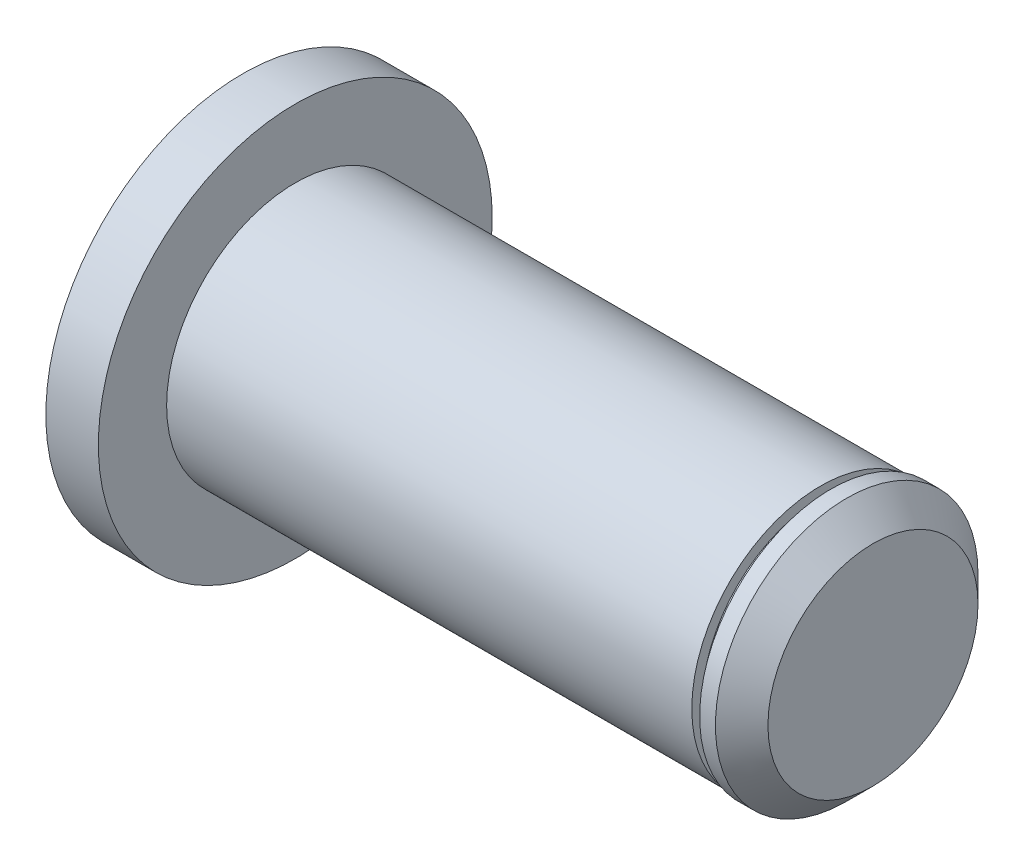
ISO-10303-21;
HEADER;
FILE_DESCRIPTION(('STEP AP214'),'2;1');
FILE_NAME('part.step','',(''),(''),'','','');
FILE_SCHEMA(('AUTOMOTIVE_DESIGN { 1 0 10303 214 1 1 1 1 }'));
ENDSEC;
DATA;
#1=APPLICATION_CONTEXT('core data for automotive mechanical design processes');
#2=APPLICATION_PROTOCOL_DEFINITION('international standard','automotive_design',2000,#1);
#3=PRODUCT_CONTEXT('',#1,'mechanical');
#4=PRODUCT('Part','Part','',(#3));
#5=PRODUCT_RELATED_PRODUCT_CATEGORY('part','',(#4));
#6=PRODUCT_DEFINITION_FORMATION('','',#4);
#7=PRODUCT_DEFINITION_CONTEXT('part definition',#1,'design');
#8=PRODUCT_DEFINITION('design','',#6,#7);
#9=PRODUCT_DEFINITION_SHAPE('','',#8);
#10=(LENGTH_UNIT() NAMED_UNIT(*) SI_UNIT(.MILLI.,.METRE.));
#11=(NAMED_UNIT(*) PLANE_ANGLE_UNIT() SI_UNIT($,.RADIAN.));
#12=(NAMED_UNIT(*) SI_UNIT($,.STERADIAN.) SOLID_ANGLE_UNIT());
#13=UNCERTAINTY_MEASURE_WITH_UNIT(LENGTH_MEASURE(1.E-05),#10,'distance_accuracy_value','');
#14=(GEOMETRIC_REPRESENTATION_CONTEXT(3) GLOBAL_UNCERTAINTY_ASSIGNED_CONTEXT((#13)) GLOBAL_UNIT_ASSIGNED_CONTEXT((#10,
#11,#12)) REPRESENTATION_CONTEXT('',''));
#15=CARTESIAN_POINT('',(0.,0.,0.));
#16=DIRECTION('',(0.,0.,1.));
#17=DIRECTION('',(1.,0.,0.));
#18=AXIS2_PLACEMENT_3D('',#15,#16,#17);
#19=CARTESIAN_POINT('',(110.,0.,0.));
#20=DIRECTION('',(1.,0.,0.));
#21=DIRECTION('',(0.,0.,-1.));
#22=AXIS2_PLACEMENT_3D('',#19,#20,#21);
#23=CYLINDRICAL_SURFACE('',#22,22.5);
#24=CARTESIAN_POINT('',(110.,0.,0.));
#25=DIRECTION('',(1.,0.,0.));
#26=DIRECTION('',(0.,0.,-1.));
#27=AXIS2_PLACEMENT_3D('',#24,#25,#26);
#28=CIRCLE('',#27,22.5);
#29=CARTESIAN_POINT('',(110.,0.,-22.5000000000001));
#30=VERTEX_POINT('',#29);
#31=EDGE_CURVE('E54',#30,#30,#28,.T.);
#32=ORIENTED_EDGE('',*,*,#31,.T.);
#33=EDGE_LOOP('',(#32));
#34=FACE_BOUND('',#33,.T.);
#35=CARTESIAN_POINT('',(112.,0.,0.));
#36=DIRECTION('',(1.,0.,0.));
#37=DIRECTION('',(0.,0.,-1.));
#38=AXIS2_PLACEMENT_3D('',#35,#36,#37);
#39=CIRCLE('',#38,22.5);
#40=CARTESIAN_POINT('',(112.,0.,-22.5000000000001));
#41=VERTEX_POINT('',#40);
#42=EDGE_CURVE('E51',#41,#41,#39,.F.);
#43=ORIENTED_EDGE('',*,*,#42,.T.);
#44=EDGE_LOOP('',(#43));
#45=FACE_BOUND('',#44,.T.);
#46=ADVANCED_FACE('F33',(#34,#45),#23,.T.);
#47=CARTESIAN_POINT('',(120.,0.,0.));
#48=DIRECTION('',(-1.,0.,0.));
#49=DIRECTION('',(0.,0.,1.));
#50=AXIS2_PLACEMENT_3D('',#47,#48,#49);
#51=CYLINDRICAL_SURFACE('',#50,24.5);
#52=CARTESIAN_POINT('',(10.,0.,0.));
#53=DIRECTION('',(1.,0.,0.));
#54=DIRECTION('',(0.,0.,-1.));
#55=AXIS2_PLACEMENT_3D('',#52,#53,#54);
#56=CIRCLE('',#55,24.5);
#57=CARTESIAN_POINT('',(10.,0.,-24.5000000000001));
#58=VERTEX_POINT('',#57);
#59=EDGE_CURVE('E58',#58,#58,#56,.T.);
#60=ORIENTED_EDGE('',*,*,#59,.T.);
#61=EDGE_LOOP('',(#60));
#62=FACE_BOUND('',#61,.T.);
#63=CARTESIAN_POINT('',(110.,0.,0.));
#64=DIRECTION('',(1.,0.,0.));
#65=DIRECTION('',(0.,0.,-1.));
#66=AXIS2_PLACEMENT_3D('',#63,#64,#65);
#67=CIRCLE('',#66,24.5);
#68=CARTESIAN_POINT('',(110.,0.,-24.5000000000001));
#69=VERTEX_POINT('',#68);
#70=EDGE_CURVE('E56',#69,#69,#67,.T.);
#71=ORIENTED_EDGE('',*,*,#70,.F.);
#72=EDGE_LOOP('',(#71));
#73=FACE_BOUND('',#72,.T.);
#74=ADVANCED_FACE('F87',(#62,#73),#51,.T.);
#75=CARTESIAN_POINT('',(10.,0.,0.));
#76=DIRECTION('',(1.,0.,0.));
#77=DIRECTION('',(0.,0.,-1.));
#78=AXIS2_PLACEMENT_3D('',#75,#76,#77);
#79=PLANE('',#78);
#80=CARTESIAN_POINT('',(10.,0.,0.));
#81=DIRECTION('',(1.,0.,0.));
#82=DIRECTION('',(0.,0.,-1.));
#83=AXIS2_PLACEMENT_3D('',#80,#81,#82);
#84=CIRCLE('',#83,37.5);
#85=CARTESIAN_POINT('',(10.,0.,-37.5000000000001));
#86=VERTEX_POINT('',#85);
#87=EDGE_CURVE('E44',#86,#86,#84,.T.);
#88=ORIENTED_EDGE('',*,*,#87,.T.);
#89=EDGE_LOOP('',(#88));
#90=FACE_BOUND('',#89,.T.);
#91=ORIENTED_EDGE('',*,*,#59,.F.);
#92=EDGE_LOOP('',(#91));
#93=FACE_BOUND('',#92,.T.);
#94=ADVANCED_FACE('F93',(#90,#93),#79,.T.);
#95=CARTESIAN_POINT('',(10.,0.,0.));
#96=DIRECTION('',(-1.,0.,0.));
#97=DIRECTION('',(0.,0.,1.));
#98=AXIS2_PLACEMENT_3D('',#95,#96,#97);
#99=CYLINDRICAL_SURFACE('',#98,37.5);
#100=ORIENTED_EDGE('',*,*,#87,.F.);
#101=EDGE_LOOP('',(#100));
#102=FACE_BOUND('',#101,.T.);
#103=CARTESIAN_POINT('',(0.,0.,0.));
#104=DIRECTION('',(1.,0.,0.));
#105=DIRECTION('',(0.,0.,-1.));
#106=AXIS2_PLACEMENT_3D('',#103,#104,#105);
#107=CIRCLE('',#106,37.5);
#108=CARTESIAN_POINT('',(0.,0.,-37.5000000000001));
#109=VERTEX_POINT('',#108);
#110=EDGE_CURVE('E48',#109,#109,#107,.T.);
#111=ORIENTED_EDGE('',*,*,#110,.T.);
#112=EDGE_LOOP('',(#111));
#113=FACE_BOUND('',#112,.T.);
#114=ADVANCED_FACE('F35',(#102,#113),#99,.T.);
#115=CARTESIAN_POINT('',(0.,0.,0.));
#116=DIRECTION('',(1.,0.,0.));
#117=DIRECTION('',(0.,0.,-1.));
#118=AXIS2_PLACEMENT_3D('',#115,#116,#117);
#119=PLANE('',#118);
#120=ORIENTED_EDGE('',*,*,#110,.F.);
#121=EDGE_LOOP('',(#120));
#122=FACE_BOUND('',#121,.T.);
#123=ADVANCED_FACE('F99',(#122),#119,.F.);
#124=CARTESIAN_POINT('',(110.,0.,0.));
#125=DIRECTION('',(1.,0.,0.));
#126=DIRECTION('',(0.,0.,-1.));
#127=AXIS2_PLACEMENT_3D('',#124,#125,#126);
#128=PLANE('',#127);
#129=ORIENTED_EDGE('',*,*,#31,.F.);
#130=EDGE_LOOP('',(#129));
#131=FACE_BOUND('',#130,.T.);
#132=ORIENTED_EDGE('',*,*,#70,.T.);
#133=EDGE_LOOP('',(#132));
#134=FACE_BOUND('',#133,.T.);
#135=ADVANCED_FACE('F82',(#131,#134),#128,.T.);
#136=CARTESIAN_POINT('',(112.,0.,0.));
#137=DIRECTION('',(1.,0.,0.));
#138=DIRECTION('',(0.,0.,-1.));
#139=AXIS2_PLACEMENT_3D('',#136,#137,#138);
#140=CYLINDRICAL_SURFACE('',#139,25.);
#141=CARTESIAN_POINT('',(115.,0.,0.));
#142=DIRECTION('',(1.,0.,0.));
#143=DIRECTION('',(0.,0.,-1.));
#144=AXIS2_PLACEMENT_3D('',#141,#142,#143);
#145=CIRCLE('',#144,25.);
#146=CARTESIAN_POINT('',(115.,0.,-25.0000000000001));
#147=VERTEX_POINT('',#146);
#148=EDGE_CURVE('E11',#147,#147,#145,.F.);
#149=ORIENTED_EDGE('',*,*,#148,.T.);
#150=EDGE_LOOP('',(#149));
#151=FACE_BOUND('',#150,.T.);
#152=CARTESIAN_POINT('',(112.,0.,0.));
#153=DIRECTION('',(1.,0.,0.));
#154=DIRECTION('',(0.,0.,-1.));
#155=AXIS2_PLACEMENT_3D('',#152,#153,#154);
#156=CIRCLE('',#155,25.);
#157=CARTESIAN_POINT('',(112.,0.,-25.0000000000001));
#158=VERTEX_POINT('',#157);
#159=EDGE_CURVE('E55',#158,#158,#156,.T.);
#160=ORIENTED_EDGE('',*,*,#159,.T.);
#161=EDGE_LOOP('',(#160));
#162=FACE_BOUND('',#161,.T.);
#163=ADVANCED_FACE('F69',(#151,#162),#140,.T.);
#164=CARTESIAN_POINT('',(112.,0.,0.));
#165=DIRECTION('',(1.,0.,0.));
#166=DIRECTION('',(0.,0.,-1.));
#167=AXIS2_PLACEMENT_3D('',#164,#165,#166);
#168=PLANE('',#167);
#169=ORIENTED_EDGE('',*,*,#42,.F.);
#170=EDGE_LOOP('',(#169));
#171=FACE_BOUND('',#170,.T.);
#172=ORIENTED_EDGE('',*,*,#159,.F.);
#173=EDGE_LOOP('',(#172));
#174=FACE_BOUND('',#173,.T.);
#175=ADVANCED_FACE('F71',(#171,#174),#168,.F.);
#176=CARTESIAN_POINT('',(120.,0.,0.));
#177=DIRECTION('',(1.,0.,0.));
#178=DIRECTION('',(0.,0.,-1.));
#179=AXIS2_PLACEMENT_3D('',#176,#177,#178);
#180=PLANE('',#179);
#181=CARTESIAN_POINT('',(120.,0.,0.));
#182=DIRECTION('',(1.,0.,0.));
#183=DIRECTION('',(0.,0.,-1.));
#184=AXIS2_PLACEMENT_3D('',#181,#182,#183);
#185=CIRCLE('',#184,20.);
#186=CARTESIAN_POINT('',(120.,0.,-20.0000000000001));
#187=VERTEX_POINT('',#186);
#188=EDGE_CURVE('E40',#187,#187,#185,.T.);
#189=ORIENTED_EDGE('',*,*,#188,.T.);
#190=EDGE_LOOP('',(#189));
#191=FACE_BOUND('',#190,.T.);
#192=ADVANCED_FACE('F73',(#191),#180,.T.);
#193=CARTESIAN_POINT('',(120.,0.,0.));
#194=DIRECTION('',(-1.,0.,0.));
#195=DIRECTION('',(0.,0.,1.));
#196=AXIS2_PLACEMENT_3D('',#193,#194,#195);
#197=CONICAL_SURFACE('',#196,20.,0.785398163397448);
#198=ORIENTED_EDGE('',*,*,#148,.F.);
#199=EDGE_LOOP('',(#198));
#200=FACE_BOUND('',#199,.T.);
#201=ORIENTED_EDGE('',*,*,#188,.F.);
#202=EDGE_LOOP('',(#201));
#203=FACE_BOUND('',#202,.T.);
#204=ADVANCED_FACE('F80',(#200,#203),#197,.T.);
#205=CLOSED_SHELL('',(#46,#74,#94,#114,#123,#135,#163,#175,#192,#204));
#206=MANIFOLD_SOLID_BREP('B2',#205);
#207=ADVANCED_BREP_SHAPE_REPRESENTATION('',(#18,#206),#14);
#208=SHAPE_DEFINITION_REPRESENTATION(#9,#207);
ENDSEC;
END-ISO-10303-21;
